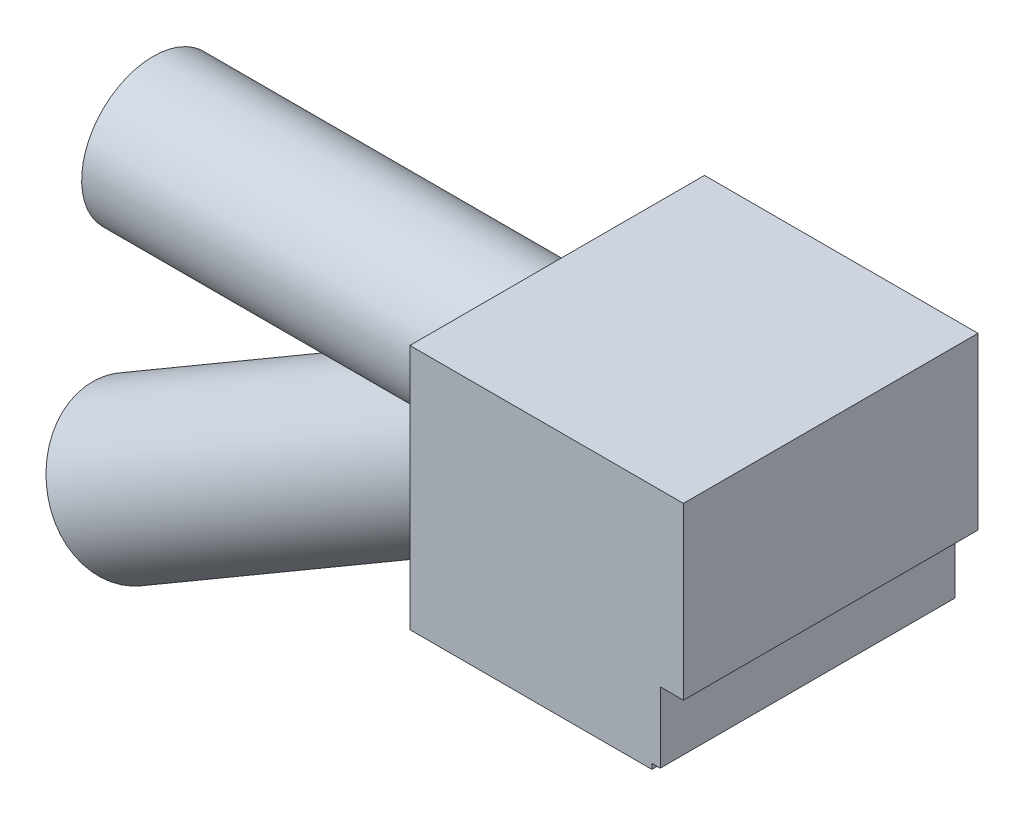
ISO-10303-21;
HEADER;
FILE_DESCRIPTION(('STEP AP214'),'2;1');
FILE_NAME('part.step','',(''),(''),'','','');
FILE_SCHEMA(('AUTOMOTIVE_DESIGN { 1 0 10303 214 1 1 1 1 }'));
ENDSEC;
DATA;
#1=APPLICATION_CONTEXT('core data for automotive mechanical design processes');
#2=APPLICATION_PROTOCOL_DEFINITION('international standard','automotive_design',2000,#1);
#3=PRODUCT_CONTEXT('',#1,'mechanical');
#4=PRODUCT('Part','Part','',(#3));
#5=PRODUCT_RELATED_PRODUCT_CATEGORY('part','',(#4));
#6=PRODUCT_DEFINITION_FORMATION('','',#4);
#7=PRODUCT_DEFINITION_CONTEXT('part definition',#1,'design');
#8=PRODUCT_DEFINITION('design','',#6,#7);
#9=PRODUCT_DEFINITION_SHAPE('','',#8);
#10=(LENGTH_UNIT() NAMED_UNIT(*) SI_UNIT(.MILLI.,.METRE.));
#11=(NAMED_UNIT(*) PLANE_ANGLE_UNIT() SI_UNIT($,.RADIAN.));
#12=(NAMED_UNIT(*) SI_UNIT($,.STERADIAN.) SOLID_ANGLE_UNIT());
#13=UNCERTAINTY_MEASURE_WITH_UNIT(LENGTH_MEASURE(1.E-05),#10,'distance_accuracy_value','');
#14=(GEOMETRIC_REPRESENTATION_CONTEXT(3) GLOBAL_UNCERTAINTY_ASSIGNED_CONTEXT((#13)) GLOBAL_UNIT_ASSIGNED_CONTEXT((#10,
#11,#12)) REPRESENTATION_CONTEXT('',''));
#15=CARTESIAN_POINT('',(0.,0.,0.));
#16=DIRECTION('',(0.,0.,1.));
#17=DIRECTION('',(1.,0.,0.));
#18=AXIS2_PLACEMENT_3D('',#15,#16,#17);
#19=CARTESIAN_POINT('',(161.,-35.5,-35.));
#20=DIRECTION('',(0.,-1.,0.));
#21=DIRECTION('',(0.,0.,-1.));
#22=AXIS2_PLACEMENT_3D('',#19,#20,#21);
#23=PLANE('',#22);
#24=DIRECTION('',(0.,0.,-1.));
#25=VECTOR('',#24,1.);
#26=CARTESIAN_POINT('',(153.5,-35.5,35.));
#27=LINE('',#26,#25);
#28=CARTESIAN_POINT('',(153.5,-35.5,35.));
#29=VERTEX_POINT('',#28);
#30=CARTESIAN_POINT('',(153.5,-35.5,-35.));
#31=VERTEX_POINT('',#30);
#32=EDGE_CURVE('E145',#29,#31,#27,.T.);
#33=ORIENTED_EDGE('',*,*,#32,.F.);
#34=DIRECTION('',(-1.,0.,0.));
#35=VECTOR('',#34,1.);
#36=CARTESIAN_POINT('',(161.,-35.5,35.));
#37=LINE('',#36,#35);
#38=CARTESIAN_POINT('',(96.,-35.5,35.));
#39=VERTEX_POINT('',#38);
#40=EDGE_CURVE('E158',#29,#39,#37,.T.);
#41=ORIENTED_EDGE('',*,*,#40,.T.);
#42=DIRECTION('',(0.,0.,1.));
#43=VECTOR('',#42,1.);
#44=CARTESIAN_POINT('',(96.,-35.5,-35.));
#45=LINE('',#44,#43);
#46=CARTESIAN_POINT('',(96.,-35.5,-35.));
#47=VERTEX_POINT('',#46);
#48=EDGE_CURVE('E239',#47,#39,#45,.T.);
#49=ORIENTED_EDGE('',*,*,#48,.F.);
#50=DIRECTION('',(-1.,0.,0.));
#51=VECTOR('',#50,1.);
#52=CARTESIAN_POINT('',(161.,-35.5,-35.));
#53=LINE('',#52,#51);
#54=EDGE_CURVE('E160',#31,#47,#53,.T.);
#55=ORIENTED_EDGE('',*,*,#54,.F.);
#56=EDGE_LOOP('',(#33,#41,#49,#55));
#57=FACE_BOUND('',#56,.T.);
#58=ADVANCED_FACE('F47',(#57),#23,.T.);
#59=CARTESIAN_POINT('',(96.,0.,0.));
#60=DIRECTION('',(-1.,0.,0.));
#61=DIRECTION('',(0.,0.,1.));
#62=AXIS2_PLACEMENT_3D('',#59,#60,#61);
#63=CYLINDRICAL_SURFACE('',#62,17.);
#64=CARTESIAN_POINT('',(96.,0.,0.));
#65=DIRECTION('',(1.,0.,0.));
#66=DIRECTION('',(0.,0.,-1.));
#67=AXIS2_PLACEMENT_3D('',#64,#65,#66);
#68=CIRCLE('',#67,17.);
#69=CARTESIAN_POINT('',(96.,-4.69691533545446,-16.3382675437628));
#70=VERTEX_POINT('',#69);
#71=CARTESIAN_POINT('',(96.,-4.69691533545446,16.3382675437628));
#72=VERTEX_POINT('',#71);
#73=EDGE_CURVE('E181',#70,#72,#68,.T.);
#74=ORIENTED_EDGE('',*,*,#73,.F.);
#75=CARTESIAN_POINT('',(96.,-4.69691533545448,-16.3382675437628));
#76=CARTESIAN_POINT('',(95.3768035131997,-4.90864242882102,-16.2773624464851));
#77=CARTESIAN_POINT('',(94.7528455649836,-5.11710335607281,-16.2130148300311));
#78=CARTESIAN_POINT('',(93.5038986398428,-5.52857564568684,-16.0773787658974));
#79=CARTESIAN_POINT('',(92.878909681072,-5.73158710293816,-16.0060904391732));
#80=CARTESIAN_POINT('',(91.6282779970139,-6.13328035518192,-15.856503933758));
#81=CARTESIAN_POINT('',(91.002635188403,-6.33196150253944,-15.7782047153525));
#82=CARTESIAN_POINT('',(89.751143370569,-6.72568659580777,-15.6144349661746));
#83=CARTESIAN_POINT('',(89.1252943600993,-6.9207305193047,-15.5289643912277));
#84=CARTESIAN_POINT('',(87.2354315876106,-7.50515813390683,-15.2596907299952));
#85=CARTESIAN_POINT('',(85.9715699467062,-7.88986162980734,-15.0645057412426));
#86=CARTESIAN_POINT('',(83.4466474989765,-8.64994947355856,-14.6412958582897));
#87=CARTESIAN_POINT('',(82.1855864399654,-9.02533469427932,-14.4132740537229));
#88=CARTESIAN_POINT('',(80.2013016473452,-9.61116838571357,-14.0246699326529));
#89=CARTESIAN_POINT('',(79.4764062780494,-9.82416206556634,-13.8764062278774));
#90=CARTESIAN_POINT('',(78.0287585798221,-10.2477978491737,-13.5665605429102));
#91=CARTESIAN_POINT('',(77.306006271192,-10.4584399307033,-13.4049784369664));
#92=CARTESIAN_POINT('',(75.8629247412258,-10.8775637584036,-13.067175736652));
#93=CARTESIAN_POINT('',(75.1425967472578,-11.086044496942,-12.8909486319386));
#94=CARTESIAN_POINT('',(73.7054295118602,-11.5007565157709,-12.522363234396));
#95=CARTESIAN_POINT('',(72.9885902039227,-11.7069878390379,-12.3300052503689));
#96=CARTESIAN_POINT('',(71.56269027101,-12.1161536982819,-11.9281465532747));
#97=CARTESIAN_POINT('',(70.8536089081119,-12.3190991907199,-11.7187309008527));
#98=CARTESIAN_POINT('',(69.4409780686424,-12.7225020306269,-11.2794909496142));
#99=CARTESIAN_POINT('',(68.7374290518986,-12.9229591720582,-11.0496649734844));
#100=CARTESIAN_POINT('',(67.3382281124436,-13.3208432165002,-10.5665982607287));
#101=CARTESIAN_POINT('',(66.6425700221168,-13.5182725356963,-10.3133774627581));
#102=CARTESIAN_POINT('',(65.2610983718102,-13.9096650657282,-9.77911463817882));
#103=CARTESIAN_POINT('',(64.5752825007004,-14.1036290929861,-9.49807926950357));
#104=CARTESIAN_POINT('',(63.5755861334499,-14.3859405458248,-9.05939134115952));
#105=CARTESIAN_POINT('',(63.2564041859541,-14.4760115922049,-8.91488467526907));
#106=CARTESIAN_POINT('',(62.6216364394691,-14.6550185921338,-8.61745916346286));
#107=CARTESIAN_POINT('',(62.3060507239782,-14.7439545193329,-8.46454012270467));
#108=CARTESIAN_POINT('',(61.6787556260204,-14.920622531397,-8.14909489384346));
#109=CARTESIAN_POINT('',(61.3670524949538,-15.0083526937101,-7.98655515965715));
#110=CARTESIAN_POINT('',(60.7489463625819,-15.1822183431645,-7.65088134667402));
#111=CARTESIAN_POINT('',(60.4425431352332,-15.2683538983279,-7.47774772114823));
#112=CARTESIAN_POINT('',(59.8413700506639,-15.4372612196273,-7.12243073819609));
#113=CARTESIAN_POINT('',(59.5464912776895,-15.5200651705356,-6.94044777880652));
#114=CARTESIAN_POINT('',(58.9646322424082,-15.6833723574817,-6.56308829329524));
#115=CARTESIAN_POINT('',(58.6776536235878,-15.7638751149289,-6.36770900937849));
#116=CARTESIAN_POINT('',(58.1145705901986,-15.9217561920743,-5.9619612550449));
#117=CARTESIAN_POINT('',(57.8384432376136,-15.9991411122731,-5.75162737340816));
#118=CARTESIAN_POINT('',(57.2997117931602,-16.1500563791864,-5.3131410701734));
#119=CARTESIAN_POINT('',(57.0370994122305,-16.2235890890645,-5.08499979171321));
#120=CARTESIAN_POINT('',(56.627332836863,-16.3382816096421,-4.69936421980443));
#121=CARTESIAN_POINT('',(56.4745333715274,-16.3810390251703,-4.54834213382224));
#122=CARTESIAN_POINT('',(56.1773435545633,-16.4641823382992,-4.23752342716372));
#123=CARTESIAN_POINT('',(56.0329544420344,-16.5045678864592,-4.07772552024727));
#124=CARTESIAN_POINT('',(55.754686493383,-16.5823835485323,-3.7487452540431));
#125=CARTESIAN_POINT('',(55.6207976518505,-16.6198164761147,-3.57957209714581));
#126=CARTESIAN_POINT('',(55.3659276511703,-16.6910608110485,-3.23111468011348));
#127=CARTESIAN_POINT('',(55.2449416924876,-16.7248735650282,-3.0518342178321));
#128=CARTESIAN_POINT('',(54.9717411070613,-16.8012150040484,-2.60568023233286));
#129=CARTESIAN_POINT('',(54.8274843731893,-16.8415147522294,-2.33340390822473));
#130=CARTESIAN_POINT('',(54.5818398096644,-16.9101281682711,-1.76862015700689));
#131=CARTESIAN_POINT('',(54.4803928059682,-16.9384583811701,-1.47614131047309));
#132=CARTESIAN_POINT('',(54.3426521038421,-16.9769212899776,-0.921581803309203));
#133=CARTESIAN_POINT('',(54.2988559072924,-16.9891495524583,-0.661542163734279));
#134=CARTESIAN_POINT('',(54.2547727483983,-17.0014579311671,-0.137584325907852));
#135=CARTESIAN_POINT('',(54.2544525278516,-17.0015473333665,0.126330753136556));
#136=CARTESIAN_POINT('',(54.2972727862391,-16.9895915777977,0.649862156378415));
#137=CARTESIAN_POINT('',(54.3403539373452,-16.9775629848133,0.909483857019315));
#138=CARTESIAN_POINT('',(54.4653857911363,-16.9426490065448,1.41843775111714));
#139=CARTESIAN_POINT('',(54.5473804648117,-16.9197513395617,1.66775795691053));
#140=CARTESIAN_POINT('',(54.7892554929759,-16.852194614065,2.26526000178069));
#141=CARTESIAN_POINT('',(54.9676256923517,-16.8023668966706,2.60529928230393));
#142=CARTESIAN_POINT('',(55.3726366086755,-16.6891889998211,3.25266003942016));
#143=CARTESIAN_POINT('',(55.5994001876492,-16.6258044009723,3.55989519631242));
#144=CARTESIAN_POINT('',(56.0663065970286,-16.495244045268,4.12103934960836));
#145=CARTESIAN_POINT('',(56.3039385007473,-16.4287742404571,4.37724722049356));
#146=CARTESIAN_POINT('',(56.7993648095779,-16.290139208285,4.86789760332107));
#147=CARTESIAN_POINT('',(57.0571776201118,-16.2179687812757,5.10231980995791));
#148=CARTESIAN_POINT('',(57.5881401691059,-16.0692692931921,5.55292573966941));
#149=CARTESIAN_POINT('',(57.8613278892075,-15.9927294306744,5.76906066861521));
#150=CARTESIAN_POINT('',(58.4186973230725,-15.8364951531452,6.18503747635537));
#151=CARTESIAN_POINT('',(58.7028746430183,-15.7568019985808,6.38488576950169));
#152=CARTESIAN_POINT('',(59.4485183114051,-15.5475908018085,6.88350439131372));
#153=CARTESIAN_POINT('',(59.9164691958994,-15.4161917454547,7.17177105434155));
#154=CARTESIAN_POINT('',(60.8674016327499,-15.1489317177499,7.72028143808541));
#155=CARTESIAN_POINT('',(61.3503912840434,-15.0130683399383,7.98050971047128));
#156=CARTESIAN_POINT('',(62.3281749709067,-14.7377476020049,8.4781947019027));
#157=CARTESIAN_POINT('',(62.8229905193312,-14.5982836480296,8.71560523199896));
#158=CARTESIAN_POINT('',(63.8207051217846,-14.3167697484384,9.17069363364851));
#159=CARTESIAN_POINT('',(64.3236025575353,-14.1747203197887,9.38837539903561));
#160=CARTESIAN_POINT('',(65.340079853242,-13.8872593258783,9.80863746095768));
#161=CARTESIAN_POINT('',(65.8537143136605,-13.7418293856021,10.0110724656994));
#162=CARTESIAN_POINT('',(66.8861134572471,-13.4491276841609,10.400979210801));
#163=CARTESIAN_POINT('',(67.4048783418694,-13.3018558506105,10.5884503609385));
#164=CARTESIAN_POINT('',(68.4459267343536,-13.0058799461495,10.9499580611024));
#165=CARTESIAN_POINT('',(68.9682054763846,-12.8571777296106,11.124009904939));
#166=CARTESIAN_POINT('',(70.0161263430186,-12.5583336239269,11.4603161341296));
#167=CARTESIAN_POINT('',(70.5417684622751,-12.4081917370705,11.6225705382318));
#168=CARTESIAN_POINT('',(71.5895094836945,-12.1083855595596,11.9345397357687));
#169=CARTESIAN_POINT('',(72.1115751595674,-11.958737176246,12.0843816898391));
#170=CARTESIAN_POINT('',(73.1579886449663,-11.6581995622465,12.3745696182059));
#171=CARTESIAN_POINT('',(73.6823365095904,-11.5073103015233,12.5149153618701));
#172=CARTESIAN_POINT('',(75.2583250835978,-11.0528134823542,12.9229021804158));
#173=CARTESIAN_POINT('',(76.3128434593999,-10.7473961307728,13.177473039461));
#174=CARTESIAN_POINT('',(78.4283518303098,-10.1313744772328,13.6567763014137));
#175=CARTESIAN_POINT('',(79.4893475678006,-9.82076494791804,13.8814763047311));
#176=CARTESIAN_POINT('',(81.6150135312395,-9.19420847530808,14.304172272754));
#177=CARTESIAN_POINT('',(82.6796836126815,-8.87826174005555,14.5021692756439));
#178=CARTESIAN_POINT('',(84.7669276003439,-8.25338497346279,14.8662988892582));
#179=CARTESIAN_POINT('',(85.7894074650441,-7.94471095861729,15.0334153272003));
#180=CARTESIAN_POINT('',(87.8353465503713,-7.3202640968382,15.347179409517));
#181=CARTESIAN_POINT('',(88.8588057728655,-7.00449123634516,15.4938270147904));
#182=CARTESIAN_POINT('',(90.3926323582327,-6.52426506494714,15.6991753759198));
#183=CARTESIAN_POINT('',(90.9031256184257,-6.3632740860414,15.7651237607255));
#184=CARTESIAN_POINT('',(91.9238459904132,-6.03861043848988,15.8923123364975));
#185=CARTESIAN_POINT('',(92.4340731032949,-5.8749377808894,15.9535525468499));
#186=CARTESIAN_POINT('',(93.454044744836,-5.54445893862278,16.071396767111));
#187=CARTESIAN_POINT('',(93.9637892769822,-5.3776527767815,16.128000810774));
#188=CARTESIAN_POINT('',(94.9825282866082,-5.04026991351415,16.2365922948268));
#189=CARTESIAN_POINT('',(95.4915227543077,-4.86969316337765,16.2885796755325));
#190=CARTESIAN_POINT('',(96.,-4.69691533545448,16.3382675437628));
#191=B_SPLINE_CURVE_WITH_KNOTS('',3,(#75,#76,#77,#78,#79,#80,#81,#82,#83,#84,#85,#86,#87,#88,
#89,#90,#91,#92,#93,#94,#95,#96,#97,#98,#99,#100,#101,#102,#103,#104,#105,#106,#107,#108,#109,
#110,#111,#112,#113,#114,#115,#116,#117,#118,#119,#120,#121,#122,#123,#124,#125,#126,#127,#128,
#129,#130,#131,#132,#133,#134,#135,#136,#137,#138,#139,#140,#141,#142,#143,#144,#145,#146,#147,
#148,#149,#150,#151,#152,#153,#154,#155,#156,#157,#158,#159,#160,#161,#162,#163,#164,#165,#166,
#167,#168,#169,#170,#171,#172,#173,#174,#175,#176,#177,#178,#179,#180,#181,#182,#183,#184,#185,
#186,#187,#188,#189,#190),.UNSPECIFIED.,.F.,.F.,(4,2,2,2,2,2,2,2,2,2,2,2,2,2,2,2,2,2,2,2,2,2,2,
2,2,2,2,2,2,2,2,2,2,2,2,2,2,2,2,2,2,2,2,2,2,2,2,2,2,2,2,2,2,2,2,2,2,4),(0.,1.98294508183663,
3.96585561314743,5.94906069846128,7.93227800095339,11.9382118913514,15.9437691072626,
18.2535143611205,20.5632814260476,22.874080833195,25.184836013569,27.4847013073626,
29.7847557785074,32.082867758687,34.3804309674884,35.4656251893609,36.5508445564497,
37.637630059093,38.724369094923,39.7928876749749,40.8616268867583,41.9279699220768,
42.9936509523474,43.6505200062849,44.3074855934105,44.9638173723566,45.6199041552115,
46.5490333075269,47.4768739242061,48.2652158298953,49.0529546672982,49.839618158356,
50.6271726772376,51.7821442609182,52.9400837535911,54.0056378290376,55.072175296294,
56.1414742144482,57.2103499424332,58.9043592639098,60.5992972127451,62.2975969118154,
63.9955606869796,65.7080656054269,67.4206380372018,69.1312288993675,70.8418170430484,
72.5318682465058,74.2219604811173,77.6023631148849,80.986402914517,84.3703111083089,
87.6132475700956,90.8561902267161,92.4741412323211,94.0920855755782,95.710018138071,
97.3279716140884),.UNSPECIFIED.);
#192=EDGE_CURVE('E235',#70,#72,#191,.T.);
#193=ORIENTED_EDGE('',*,*,#192,.T.);
#194=EDGE_LOOP('',(#74,#193));
#195=FACE_BOUND('',#194,.T.);
#196=CARTESIAN_POINT('',(0.,0.,0.));
#197=DIRECTION('',(1.,0.,0.));
#198=DIRECTION('',(0.,0.,-1.));
#199=AXIS2_PLACEMENT_3D('',#196,#197,#198);
#200=CIRCLE('',#199,17.);
#201=CARTESIAN_POINT('',(0.,0.,-17.));
#202=VERTEX_POINT('',#201);
#203=EDGE_CURVE('E186',#202,#202,#200,.T.);
#204=ORIENTED_EDGE('',*,*,#203,.T.);
#205=EDGE_LOOP('',(#204));
#206=FACE_BOUND('',#205,.T.);
#207=ADVANCED_FACE('F256',(#195,#206),#63,.T.);
#208=CARTESIAN_POINT('',(0.,0.,0.));
#209=DIRECTION('',(1.,0.,0.));
#210=DIRECTION('',(0.,0.,-1.));
#211=AXIS2_PLACEMENT_3D('',#208,#209,#210);
#212=PLANE('',#211);
#213=ORIENTED_EDGE('',*,*,#203,.F.);
#214=EDGE_LOOP('',(#213));
#215=FACE_BOUND('',#214,.T.);
#216=ADVANCED_FACE('F274',(#215),#212,.F.);
#217=CARTESIAN_POINT('',(161.,23.,-35.));
#218=DIRECTION('',(0.,0.,-1.));
#219=DIRECTION('',(0.,1.,0.));
#220=AXIS2_PLACEMENT_3D('',#217,#218,#219);
#221=PLANE('',#220);
#222=DIRECTION('',(1.,0.,0.));
#223=VECTOR('',#222,1.);
#224=CARTESIAN_POINT('',(153.5,-34.25,-35.));
#225=LINE('',#224,#223);
#226=CARTESIAN_POINT('',(153.5,-34.25,-35.));
#227=VERTEX_POINT('',#226);
#228=CARTESIAN_POINT('',(155.5,-34.25,-35.));
#229=VERTEX_POINT('',#228);
#230=EDGE_CURVE('E360',#227,#229,#225,.T.);
#231=ORIENTED_EDGE('',*,*,#230,.F.);
#232=DIRECTION('',(0.,1.,0.));
#233=VECTOR('',#232,1.);
#234=CARTESIAN_POINT('',(153.5,-35.5,-35.));
#235=LINE('',#234,#233);
#236=EDGE_CURVE('E162',#31,#227,#235,.T.);
#237=ORIENTED_EDGE('',*,*,#236,.F.);
#238=ORIENTED_EDGE('',*,*,#54,.T.);
#239=DIRECTION('',(0.,-1.,0.));
#240=VECTOR('',#239,1.);
#241=CARTESIAN_POINT('',(96.,23.,-35.));
#242=LINE('',#241,#240);
#243=CARTESIAN_POINT('',(96.,23.,-35.));
#244=VERTEX_POINT('',#243);
#245=EDGE_CURVE('E343',#244,#47,#242,.T.);
#246=ORIENTED_EDGE('',*,*,#245,.F.);
#247=DIRECTION('',(-1.,0.,0.));
#248=VECTOR('',#247,1.);
#249=CARTESIAN_POINT('',(161.,23.,-35.));
#250=LINE('',#249,#248);
#251=CARTESIAN_POINT('',(161.,23.,-35.));
#252=VERTEX_POINT('',#251);
#253=EDGE_CURVE('E174',#252,#244,#250,.T.);
#254=ORIENTED_EDGE('',*,*,#253,.F.);
#255=DIRECTION('',(0.,-1.,0.));
#256=VECTOR('',#255,1.);
#257=CARTESIAN_POINT('',(161.,23.,-35.));
#258=LINE('',#257,#256);
#259=CARTESIAN_POINT('',(161.,-17.5,-35.));
#260=VERTEX_POINT('',#259);
#261=EDGE_CURVE('E170',#252,#260,#258,.T.);
#262=ORIENTED_EDGE('',*,*,#261,.T.);
#263=DIRECTION('',(1.,0.,0.));
#264=VECTOR('',#263,1.);
#265=CARTESIAN_POINT('',(155.5,-17.5,-35.));
#266=LINE('',#265,#264);
#267=CARTESIAN_POINT('',(155.5,-17.5,-35.));
#268=VERTEX_POINT('',#267);
#269=EDGE_CURVE('E244',#268,#260,#266,.T.);
#270=ORIENTED_EDGE('',*,*,#269,.F.);
#271=DIRECTION('',(0.,1.,0.));
#272=VECTOR('',#271,1.);
#273=CARTESIAN_POINT('',(155.5,-35.5,-35.));
#274=LINE('',#273,#272);
#275=EDGE_CURVE('E339',#229,#268,#274,.T.);
#276=ORIENTED_EDGE('',*,*,#275,.F.);
#277=EDGE_LOOP('',(#231,#237,#238,#246,#254,#262,#270,#276));
#278=FACE_BOUND('',#277,.T.);
#279=ADVANCED_FACE('F270',(#278),#221,.T.);
#280=CARTESIAN_POINT('',(161.,23.,35.));
#281=DIRECTION('',(0.,1.,0.));
#282=DIRECTION('',(0.,0.,1.));
#283=AXIS2_PLACEMENT_3D('',#280,#281,#282);
#284=PLANE('',#283);
#285=DIRECTION('',(0.,0.,-1.));
#286=VECTOR('',#285,1.);
#287=CARTESIAN_POINT('',(96.,23.,35.));
#288=LINE('',#287,#286);
#289=CARTESIAN_POINT('',(96.,23.,35.));
#290=VERTEX_POINT('',#289);
#291=EDGE_CURVE('E347',#290,#244,#288,.T.);
#292=ORIENTED_EDGE('',*,*,#291,.F.);
#293=DIRECTION('',(-1.,0.,0.));
#294=VECTOR('',#293,1.);
#295=CARTESIAN_POINT('',(161.,23.,35.));
#296=LINE('',#295,#294);
#297=CARTESIAN_POINT('',(161.,23.,35.));
#298=VERTEX_POINT('',#297);
#299=EDGE_CURVE('E169',#298,#290,#296,.T.);
#300=ORIENTED_EDGE('',*,*,#299,.F.);
#301=DIRECTION('',(0.,0.,-1.));
#302=VECTOR('',#301,1.);
#303=CARTESIAN_POINT('',(161.,23.,35.));
#304=LINE('',#303,#302);
#305=EDGE_CURVE('E177',#298,#252,#304,.T.);
#306=ORIENTED_EDGE('',*,*,#305,.T.);
#307=ORIENTED_EDGE('',*,*,#253,.T.);
#308=EDGE_LOOP('',(#292,#300,#306,#307));
#309=FACE_BOUND('',#308,.T.);
#310=ADVANCED_FACE('F273',(#309),#284,.T.);
#311=CARTESIAN_POINT('',(161.,-35.5,35.));
#312=DIRECTION('',(0.,0.,1.));
#313=DIRECTION('',(0.,-1.,0.));
#314=AXIS2_PLACEMENT_3D('',#311,#312,#313);
#315=PLANE('',#314);
#316=DIRECTION('',(1.,0.,0.));
#317=VECTOR('',#316,1.);
#318=CARTESIAN_POINT('',(153.5,-34.25,35.));
#319=LINE('',#318,#317);
#320=CARTESIAN_POINT('',(153.5,-34.25,35.));
#321=VERTEX_POINT('',#320);
#322=CARTESIAN_POINT('',(155.5,-34.25,35.));
#323=VERTEX_POINT('',#322);
#324=EDGE_CURVE('E332',#321,#323,#319,.T.);
#325=ORIENTED_EDGE('',*,*,#324,.T.);
#326=DIRECTION('',(0.,-1.,0.));
#327=VECTOR('',#326,1.);
#328=CARTESIAN_POINT('',(155.5,-35.5,35.));
#329=LINE('',#328,#327);
#330=CARTESIAN_POINT('',(155.5,-17.5,35.));
#331=VERTEX_POINT('',#330);
#332=EDGE_CURVE('E337',#331,#323,#329,.T.);
#333=ORIENTED_EDGE('',*,*,#332,.F.);
#334=DIRECTION('',(1.,0.,0.));
#335=VECTOR('',#334,1.);
#336=CARTESIAN_POINT('',(155.5,-17.5,35.));
#337=LINE('',#336,#335);
#338=CARTESIAN_POINT('',(161.,-17.5,35.));
#339=VERTEX_POINT('',#338);
#340=EDGE_CURVE('E325',#331,#339,#337,.T.);
#341=ORIENTED_EDGE('',*,*,#340,.T.);
#342=DIRECTION('',(0.,1.,0.));
#343=VECTOR('',#342,1.);
#344=CARTESIAN_POINT('',(161.,-35.5,35.));
#345=LINE('',#344,#343);
#346=EDGE_CURVE('E254',#339,#298,#345,.T.);
#347=ORIENTED_EDGE('',*,*,#346,.T.);
#348=ORIENTED_EDGE('',*,*,#299,.T.);
#349=DIRECTION('',(0.,1.,0.));
#350=VECTOR('',#349,1.);
#351=CARTESIAN_POINT('',(96.,-35.5,35.));
#352=LINE('',#351,#350);
#353=EDGE_CURVE('E166',#39,#290,#352,.T.);
#354=ORIENTED_EDGE('',*,*,#353,.F.);
#355=ORIENTED_EDGE('',*,*,#40,.F.);
#356=DIRECTION('',(0.,-1.,0.));
#357=VECTOR('',#356,1.);
#358=CARTESIAN_POINT('',(153.5,-35.5,35.));
#359=LINE('',#358,#357);
#360=EDGE_CURVE('E142',#321,#29,#359,.T.);
#361=ORIENTED_EDGE('',*,*,#360,.F.);
#362=EDGE_LOOP('',(#325,#333,#341,#347,#348,#354,#355,#361));
#363=FACE_BOUND('',#362,.T.);
#364=ADVANCED_FACE('F164',(#363),#315,.T.);
#365=CARTESIAN_POINT('',(161.,0.,0.));
#366=DIRECTION('',(-1.,0.,0.));
#367=DIRECTION('',(0.,0.,1.));
#368=AXIS2_PLACEMENT_3D('',#365,#366,#367);
#369=PLANE('',#368);
#370=ORIENTED_EDGE('',*,*,#346,.F.);
#371=DIRECTION('',(0.,0.,1.));
#372=VECTOR('',#371,1.);
#373=CARTESIAN_POINT('',(161.,-17.5,35.));
#374=LINE('',#373,#372);
#375=EDGE_CURVE('E322',#260,#339,#374,.T.);
#376=ORIENTED_EDGE('',*,*,#375,.F.);
#377=ORIENTED_EDGE('',*,*,#261,.F.);
#378=ORIENTED_EDGE('',*,*,#305,.F.);
#379=EDGE_LOOP('',(#370,#376,#377,#378));
#380=FACE_BOUND('',#379,.T.);
#381=ADVANCED_FACE('F264',(#380),#369,.F.);
#382=CARTESIAN_POINT('',(96.,0.,0.));
#383=DIRECTION('',(-1.,0.,0.));
#384=DIRECTION('',(0.,0.,1.));
#385=AXIS2_PLACEMENT_3D('',#382,#383,#384);
#386=PLANE('',#385);
#387=CARTESIAN_POINT('',(96.,-13.4471043189838,-19.5));
#388=DIRECTION('',(-1.,0.,0.));
#389=DIRECTION('',(0.,-1.,0.));
#390=AXIS2_PLACEMENT_3D('',#387,#388,#389);
#391=ELLIPSE('',#390,2.89592760180995,2.5);
#392=CARTESIAN_POINT('',(96.,-10.6293421157011,-18.9230769230769));
#393=VERTEX_POINT('',#392);
#394=CARTESIAN_POINT('',(96.,-16.2648665222664,-18.9230769230769));
#395=VERTEX_POINT('',#394);
#396=EDGE_CURVE('E225',#393,#395,#391,.T.);
#397=ORIENTED_EDGE('',*,*,#396,.F.);
#398=CARTESIAN_POINT('',(96.,-9.50223723438807,-18.6923076923077));
#399=DIRECTION('',(-1.,0.,0.));
#400=DIRECTION('',(0.,-1.,0.));
#401=AXIS2_PLACEMENT_3D('',#398,#399,#400);
#402=ELLIPSE('',#401,1.15837104072398,1.);
#403=CARTESIAN_POINT('',(96.,-9.70986181778784,-17.7085020242915));
#404=VERTEX_POINT('',#403);
#405=EDGE_CURVE('E204',#393,#404,#402,.T.);
#406=ORIENTED_EDGE('',*,*,#405,.T.);
#407=CARTESIAN_POINT('',(96.,-13.4471043189838,0.));
#408=DIRECTION('',(-1.,0.,0.));
#409=DIRECTION('',(0.,1.,0.));
#410=AXIS2_PLACEMENT_3D('',#407,#408,#409);
#411=ELLIPSE('',#410,20.8506787330317,18.);
#412=EDGE_CURVE('E190',#70,#404,#411,.T.);
#413=ORIENTED_EDGE('',*,*,#412,.F.);
#414=ORIENTED_EDGE('',*,*,#73,.T.);
#415=CARTESIAN_POINT('',(96.,-17.1843468201797,-17.7085020242915));
#416=VERTEX_POINT('',#415);
#417=EDGE_CURVE('E185',#416,#72,#411,.T.);
#418=ORIENTED_EDGE('',*,*,#417,.F.);
#419=CARTESIAN_POINT('',(96.,-17.3919714035795,-18.6923076923077));
#420=DIRECTION('',(-1.,0.,0.));
#421=DIRECTION('',(0.,1.,0.));
#422=AXIS2_PLACEMENT_3D('',#419,#420,#421);
#423=ELLIPSE('',#422,1.15837104072398,1.);
#424=EDGE_CURVE('E201',#416,#395,#423,.T.);
#425=ORIENTED_EDGE('',*,*,#424,.T.);
#426=EDGE_LOOP('',(#397,#406,#413,#414,#418,#425));
#427=FACE_BOUND('',#426,.T.);
#428=ORIENTED_EDGE('',*,*,#48,.T.);
#429=ORIENTED_EDGE('',*,*,#353,.T.);
#430=ORIENTED_EDGE('',*,*,#291,.T.);
#431=ORIENTED_EDGE('',*,*,#245,.T.);
#432=EDGE_LOOP('',(#428,#429,#430,#431));
#433=FACE_BOUND('',#432,.T.);
#434=ADVANCED_FACE('F229',(#427,#433),#386,.T.);
#435=CARTESIAN_POINT('',(-5.31249999999994,-72.6801372023334,0.));
#436=DIRECTION('',(0.86328125,0.504723175016204,0.));
#437=DIRECTION('',(-0.504723175016204,0.86328125,0.));
#438=AXIS2_PLACEMENT_3D('',#435,#436,#437);
#439=CYLINDRICAL_SURFACE('',#438,18.);
#440=ORIENTED_EDGE('',*,*,#412,.T.);
#441=DIRECTION('',(0.86328125,0.504723175016204,0.));
#442=VECTOR('',#441,1.);
#443=CARTESIAN_POINT('',(-6.94088402782421,-69.8949403486818,-17.7085020242915));
#444=LINE('',#443,#442);
#445=CARTESIAN_POINT('',(-6.94088402782421,-69.8949403486818,-17.7085020242915));
#446=VERTEX_POINT('',#445);
#447=EDGE_CURVE('E68',#404,#446,#444,.F.);
#448=ORIENTED_EDGE('',*,*,#447,.T.);
#449=CARTESIAN_POINT('',(-5.31249999999994,-72.6801372023334,0.));
#450=DIRECTION('',(0.86328125,0.504723175016204,0.));
#451=DIRECTION('',(-0.504723175016204,0.86328125,0.));
#452=AXIS2_PLACEMENT_3D('',#449,#450,#451);
#453=CIRCLE('',#452,18.);
#454=CARTESIAN_POINT('',(-3.68411597217567,-75.465334055985,-17.7085020242915));
#455=VERTEX_POINT('',#454);
#456=EDGE_CURVE('E216',#446,#455,#453,.T.);
#457=ORIENTED_EDGE('',*,*,#456,.T.);
#458=DIRECTION('',(0.86328125,0.504723175016204,0.));
#459=VECTOR('',#458,1.);
#460=CARTESIAN_POINT('',(-3.68411597217566,-75.465334055985,-17.7085020242915));
#461=LINE('',#460,#459);
#462=EDGE_CURVE('E207',#455,#416,#461,.T.);
#463=ORIENTED_EDGE('',*,*,#462,.T.);
#464=ORIENTED_EDGE('',*,*,#417,.T.);
#465=ORIENTED_EDGE('',*,*,#192,.F.);
#466=EDGE_LOOP('',(#440,#448,#457,#463,#464,#465));
#467=FACE_BOUND('',#466,.T.);
#468=ADVANCED_FACE('F233',(#467),#439,.T.);
#469=CARTESIAN_POINT('',(-5.31249999999994,-72.6801372023334,0.));
#470=DIRECTION('',(0.86328125,0.504723175016204,0.));
#471=DIRECTION('',(-0.504723175016204,0.86328125,0.));
#472=AXIS2_PLACEMENT_3D('',#469,#470,#471);
#473=PLANE('',#472);
#474=ORIENTED_EDGE('',*,*,#456,.F.);
#475=CARTESIAN_POINT('',(-7.03134980714778,-69.7402071901456,-18.6923076923077));
#476=DIRECTION('',(0.86328125,0.504723175016204,0.));
#477=DIRECTION('',(-0.504723175016204,0.86328125,0.));
#478=AXIS2_PLACEMENT_3D('',#475,#476,#477);
#479=CIRCLE('',#478,1.);
#480=CARTESIAN_POINT('',(-6.54024986224841,-70.5801871936279,-18.9230769230769));
#481=VERTEX_POINT('',#480);
#482=EDGE_CURVE('E56',#446,#481,#479,.T.);
#483=ORIENTED_EDGE('',*,*,#482,.T.);
#484=CARTESIAN_POINT('',(-5.31249999999995,-72.6801372023334,-19.5));
#485=DIRECTION('',(-0.86328125,-0.504723175016204,0.));
#486=DIRECTION('',(0.504723175016204,-0.86328125,0.));
#487=AXIS2_PLACEMENT_3D('',#484,#485,#486);
#488=CIRCLE('',#487,2.5);
#489=CARTESIAN_POINT('',(-4.08475013775151,-74.780087211039,-18.9230769230769));
#490=VERTEX_POINT('',#489);
#491=EDGE_CURVE('E215',#481,#490,#488,.T.);
#492=ORIENTED_EDGE('',*,*,#491,.T.);
#493=CARTESIAN_POINT('',(-3.59365019285209,-75.6200672145212,-18.6923076923077));
#494=DIRECTION('',(0.86328125,0.504723175016204,0.));
#495=DIRECTION('',(-0.504723175016204,0.86328125,0.));
#496=AXIS2_PLACEMENT_3D('',#493,#494,#495);
#497=CIRCLE('',#496,1.);
#498=EDGE_CURVE('E11',#490,#455,#497,.T.);
#499=ORIENTED_EDGE('',*,*,#498,.T.);
#500=EDGE_LOOP('',(#474,#483,#492,#499));
#501=FACE_BOUND('',#500,.T.);
#502=ADVANCED_FACE('F214',(#501),#473,.F.);
#503=CARTESIAN_POINT('',(155.5,-17.5,35.));
#504=DIRECTION('',(0.,1.,0.));
#505=DIRECTION('',(0.,0.,1.));
#506=AXIS2_PLACEMENT_3D('',#503,#504,#505);
#507=PLANE('',#506);
#508=ORIENTED_EDGE('',*,*,#375,.T.);
#509=ORIENTED_EDGE('',*,*,#340,.F.);
#510=DIRECTION('',(0.,0.,1.));
#511=VECTOR('',#510,1.);
#512=CARTESIAN_POINT('',(155.5,-17.5,35.));
#513=LINE('',#512,#511);
#514=EDGE_CURVE('E331',#268,#331,#513,.T.);
#515=ORIENTED_EDGE('',*,*,#514,.F.);
#516=ORIENTED_EDGE('',*,*,#269,.T.);
#517=EDGE_LOOP('',(#508,#509,#515,#516));
#518=FACE_BOUND('',#517,.T.);
#519=ADVANCED_FACE('F315',(#518),#507,.F.);
#520=CARTESIAN_POINT('',(155.5,0.,0.));
#521=DIRECTION('',(1.,0.,0.));
#522=DIRECTION('',(0.,0.,-1.));
#523=AXIS2_PLACEMENT_3D('',#520,#521,#522);
#524=PLANE('',#523);
#525=DIRECTION('',(0.,0.,1.));
#526=VECTOR('',#525,1.);
#527=CARTESIAN_POINT('',(155.5,-34.25,35.));
#528=LINE('',#527,#526);
#529=EDGE_CURVE('E153',#229,#323,#528,.T.);
#530=ORIENTED_EDGE('',*,*,#529,.F.);
#531=ORIENTED_EDGE('',*,*,#275,.T.);
#532=ORIENTED_EDGE('',*,*,#514,.T.);
#533=ORIENTED_EDGE('',*,*,#332,.T.);
#534=EDGE_LOOP('',(#530,#531,#532,#533));
#535=FACE_BOUND('',#534,.T.);
#536=ADVANCED_FACE('F312',(#535),#524,.T.);
#537=CARTESIAN_POINT('',(153.5,-34.25,35.));
#538=DIRECTION('',(0.,1.,0.));
#539=DIRECTION('',(0.,0.,1.));
#540=AXIS2_PLACEMENT_3D('',#537,#538,#539);
#541=PLANE('',#540);
#542=ORIENTED_EDGE('',*,*,#529,.T.);
#543=ORIENTED_EDGE('',*,*,#324,.F.);
#544=DIRECTION('',(0.,0.,1.));
#545=VECTOR('',#544,1.);
#546=CARTESIAN_POINT('',(153.5,-34.25,35.));
#547=LINE('',#546,#545);
#548=EDGE_CURVE('E148',#227,#321,#547,.T.);
#549=ORIENTED_EDGE('',*,*,#548,.F.);
#550=ORIENTED_EDGE('',*,*,#230,.T.);
#551=EDGE_LOOP('',(#542,#543,#549,#550));
#552=FACE_BOUND('',#551,.T.);
#553=ADVANCED_FACE('F307',(#552),#541,.F.);
#554=CARTESIAN_POINT('',(153.5,0.,0.));
#555=DIRECTION('',(-1.,0.,0.));
#556=DIRECTION('',(0.,0.,1.));
#557=AXIS2_PLACEMENT_3D('',#554,#555,#556);
#558=PLANE('',#557);
#559=ORIENTED_EDGE('',*,*,#360,.T.);
#560=ORIENTED_EDGE('',*,*,#32,.T.);
#561=ORIENTED_EDGE('',*,*,#236,.T.);
#562=ORIENTED_EDGE('',*,*,#548,.T.);
#563=EDGE_LOOP('',(#559,#560,#561,#562));
#564=FACE_BOUND('',#563,.T.);
#565=ADVANCED_FACE('F144',(#564),#558,.F.);
#566=CARTESIAN_POINT('',(98.28125,-12.1133562003889,-19.5));
#567=DIRECTION('',(-0.86328125,-0.504723175016204,0.));
#568=DIRECTION('',(0.504723175016204,-0.86328125,0.));
#569=AXIS2_PLACEMENT_3D('',#566,#567,#568);
#570=CYLINDRICAL_SURFACE('',#569,2.5);
#571=ORIENTED_EDGE('',*,*,#491,.F.);
#572=DIRECTION('',(-0.86328125,-0.504723175016204,0.));
#573=VECTOR('',#572,1.);
#574=CARTESIAN_POINT('',(97.0535001377516,-10.0134061916833,-18.9230769230769));
#575=LINE('',#574,#573);
#576=EDGE_CURVE('E197',#481,#393,#575,.F.);
#577=ORIENTED_EDGE('',*,*,#576,.T.);
#578=ORIENTED_EDGE('',*,*,#396,.T.);
#579=DIRECTION('',(-0.86328125,-0.504723175016204,0.));
#580=VECTOR('',#579,1.);
#581=CARTESIAN_POINT('',(99.5089998622485,-14.2133062090945,-18.9230769230769));
#582=LINE('',#581,#580);
#583=EDGE_CURVE('E193',#395,#490,#582,.T.);
#584=ORIENTED_EDGE('',*,*,#583,.T.);
#585=EDGE_LOOP('',(#571,#577,#578,#584));
#586=FACE_BOUND('',#585,.T.);
#587=ADVANCED_FACE('F220',(#586),#570,.T.);
#588=CARTESIAN_POINT('',(-7.03134980714776,-69.7402071901456,-18.6923076923077));
#589=DIRECTION('',(-0.86328125,-0.504723175016204,0.));
#590=DIRECTION('',(0.504723175016204,-0.86328125,0.));
#591=AXIS2_PLACEMENT_3D('',#588,#589,#590);
#592=CYLINDRICAL_SURFACE('',#591,1.);
#593=ORIENTED_EDGE('',*,*,#482,.F.);
#594=ORIENTED_EDGE('',*,*,#447,.F.);
#595=ORIENTED_EDGE('',*,*,#405,.F.);
#596=ORIENTED_EDGE('',*,*,#576,.F.);
#597=EDGE_LOOP('',(#593,#594,#595,#596));
#598=FACE_BOUND('',#597,.T.);
#599=ADVANCED_FACE('F227',(#598),#592,.F.);
#600=CARTESIAN_POINT('',(-3.59365019285207,-75.6200672145212,-18.6923076923077));
#601=DIRECTION('',(0.86328125,0.504723175016204,0.));
#602=DIRECTION('',(-0.504723175016204,0.86328125,0.));
#603=AXIS2_PLACEMENT_3D('',#600,#601,#602);
#604=CYLINDRICAL_SURFACE('',#603,1.);
#605=ORIENTED_EDGE('',*,*,#424,.F.);
#606=ORIENTED_EDGE('',*,*,#462,.F.);
#607=ORIENTED_EDGE('',*,*,#498,.F.);
#608=ORIENTED_EDGE('',*,*,#583,.F.);
#609=EDGE_LOOP('',(#605,#606,#607,#608));
#610=FACE_BOUND('',#609,.T.);
#611=ADVANCED_FACE('F49',(#610),#604,.F.);
#612=CLOSED_SHELL('',(#58,#207,#216,#279,#310,#364,#381,#434,#468,#502,#519,#536,#553,#565,#587,
#599,#611));
#613=MANIFOLD_SOLID_BREP('B2',#612);
#614=ADVANCED_BREP_SHAPE_REPRESENTATION('',(#18,#613),#14);
#615=SHAPE_DEFINITION_REPRESENTATION(#9,#614);
ENDSEC;
END-ISO-10303-21;
